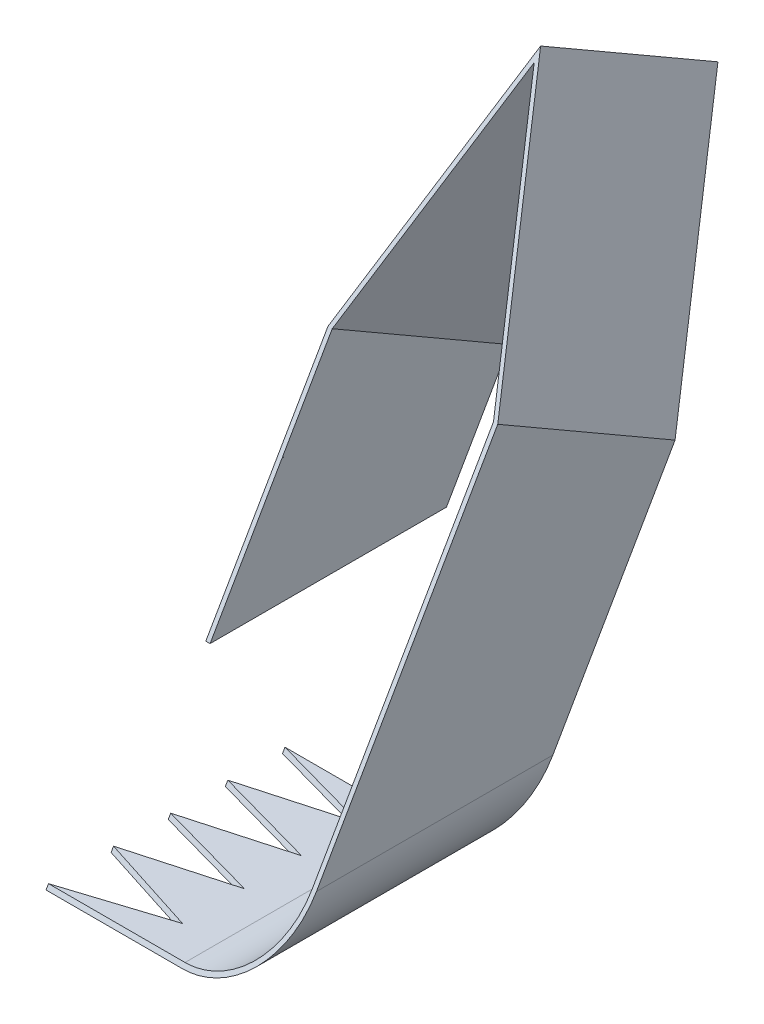
ISO-10303-21;
HEADER;
FILE_DESCRIPTION(('STEP AP214'),'2;1');
FILE_NAME('part.step','',(''),(''),'','','');
FILE_SCHEMA(('AUTOMOTIVE_DESIGN { 1 0 10303 214 1 1 1 1 }'));
ENDSEC;
DATA;
#1=APPLICATION_CONTEXT('core data for automotive mechanical design processes');
#2=APPLICATION_PROTOCOL_DEFINITION('international standard','automotive_design',2000,#1);
#3=PRODUCT_CONTEXT('',#1,'mechanical');
#4=PRODUCT('Part','Part','',(#3));
#5=PRODUCT_RELATED_PRODUCT_CATEGORY('part','',(#4));
#6=PRODUCT_DEFINITION_FORMATION('','',#4);
#7=PRODUCT_DEFINITION_CONTEXT('part definition',#1,'design');
#8=PRODUCT_DEFINITION('design','',#6,#7);
#9=PRODUCT_DEFINITION_SHAPE('','',#8);
#10=(LENGTH_UNIT() NAMED_UNIT(*) SI_UNIT(.MILLI.,.METRE.));
#11=(NAMED_UNIT(*) PLANE_ANGLE_UNIT() SI_UNIT($,.RADIAN.));
#12=(NAMED_UNIT(*) SI_UNIT($,.STERADIAN.) SOLID_ANGLE_UNIT());
#13=UNCERTAINTY_MEASURE_WITH_UNIT(LENGTH_MEASURE(1.E-05),#10,'distance_accuracy_value','');
#14=(GEOMETRIC_REPRESENTATION_CONTEXT(3) GLOBAL_UNCERTAINTY_ASSIGNED_CONTEXT((#13)) GLOBAL_UNIT_ASSIGNED_CONTEXT((#10,
#11,#12)) REPRESENTATION_CONTEXT('',''));
#15=CARTESIAN_POINT('',(0.,0.,0.));
#16=DIRECTION('',(0.,0.,1.));
#17=DIRECTION('',(1.,0.,0.));
#18=AXIS2_PLACEMENT_3D('',#15,#16,#17);
#19=CARTESIAN_POINT('',(-31.5905173417457,-187.563529342786,-148.740190106902));
#20=DIRECTION('',(-1.0041011564048E-12,0.866025403784441,-0.499999999999995));
#21=DIRECTION('',(0.,0.499999999999995,0.866025403784442));
#22=AXIS2_PLACEMENT_3D('',#19,#20,#21);
#23=PLANE('',#22);
#24=DIRECTION('',(-1.,-8.69598958078802E-13,5.02012735208159E-13));
#25=VECTOR('',#24,1.);
#26=CARTESIAN_POINT('',(-31.5905173417457,-76.2662554089391,44.0323430904352));
#27=LINE('',#26,#25);
#28=CARTESIAN_POINT('',(30.0030173417445,-76.2662554088856,44.0323430904042));
#29=VERTEX_POINT('',#28);
#30=CARTESIAN_POINT('',(29.8722197238395,-76.2662554088839,44.0323430904058));
#31=VERTEX_POINT('',#30);
#32=EDGE_CURVE('E46',#29,#31,#27,.T.);
#33=ORIENTED_EDGE('',*,*,#32,.F.);
#34=DIRECTION('',(0.,-0.499999999999995,-0.866025403784442));
#35=VECTOR('',#34,1.);
#36=CARTESIAN_POINT('',(30.0030173417445,-187.563529342732,-148.740190106932));
#37=LINE('',#36,#35);
#38=CARTESIAN_POINT('',(30.0030173417445,-76.5820287921031,43.4854075470633));
#39=VERTEX_POINT('',#38);
#40=EDGE_CURVE('E11',#29,#39,#37,.T.);
#41=ORIENTED_EDGE('',*,*,#40,.T.);
#42=DIRECTION('',(0.202803010333532,-0.489609778037303,-0.848029011443547));
#43=VECTOR('',#42,1.);
#44=CARTESIAN_POINT('',(-5597.68387285999,13509.8559863222,23575.8863436219));
#45=LINE('',#44,#43);
#46=EDGE_CURVE('E287',#31,#39,#45,.T.);
#47=ORIENTED_EDGE('',*,*,#46,.F.);
#48=EDGE_LOOP('',(#33,#41,#47));
#49=FACE_BOUND('',#48,.T.);
#50=ADVANCED_FACE('F33',(#49),#23,.T.);
#51=CARTESIAN_POINT('',(0.,-38.0999999999996,-65.9911357683745));
#52=DIRECTION('',(0.,-0.499999999999995,-0.866025403784442));
#53=DIRECTION('',(0.,0.866025403784442,-0.499999999999995));
#54=AXIS2_PLACEMENT_3D('',#51,#52,#53);
#55=PLANE('',#54);
#56=DIRECTION('',(0.,-0.866025403784442,0.499999999999995));
#57=VECTOR('',#56,1.);
#58=CARTESIAN_POINT('',(30.0030173416985,252509.141421164,-145874.208953373));
#59=LINE('',#58,#57);
#60=CARTESIAN_POINT('',(30.0030173417445,-82.3509859396307,-40.4428171242225));
#61=VERTEX_POINT('',#60);
#62=CARTESIAN_POINT('',(30.0030173417445,-161.108289208869,5.02773311893634));
#63=VERTEX_POINT('',#62);
#64=EDGE_CURVE('E286',#61,#63,#59,.T.);
#65=ORIENTED_EDGE('',*,*,#64,.F.);
#66=DIRECTION('',(-0.315271997454304,0.821859279752857,-0.474500676401297));
#67=VECTOR('',#66,1.);
#68=CARTESIAN_POINT('',(30.0030173417445,-82.3509859396307,-40.4428171242225));
#69=LINE('',#68,#67);
#70=CARTESIAN_POINT('',(0.,-4.13833647502804,-85.5989113466441));
#71=VERTEX_POINT('',#70);
#72=EDGE_CURVE('E263',#61,#71,#69,.T.);
#73=ORIENTED_EDGE('',*,*,#72,.T.);
#74=DIRECTION('',(-0.315271997446998,-0.821859279754959,0.474500676402511));
#75=VECTOR('',#74,1.);
#76=CARTESIAN_POINT('',(0.,-4.13833647502802,-85.5989113466441));
#77=LINE('',#76,#75);
#78=CARTESIAN_POINT('',(-30.0030173409861,-82.3509859396663,-40.4428171242019));
#79=VERTEX_POINT('',#78);
#80=EDGE_CURVE('E260',#71,#79,#77,.T.);
#81=ORIENTED_EDGE('',*,*,#80,.T.);
#82=DIRECTION('',(-2.13245697308716E-11,-0.866025403784442,0.499999999999995));
#83=VECTOR('',#82,1.);
#84=CARTESIAN_POINT('',(-30.0030173417745,-114.366255408937,-21.9587926779401));
#85=LINE('',#84,#83);
#86=CARTESIAN_POINT('',(-30.0030173417554,-123.008289208855,-16.9693121372121));
#87=VERTEX_POINT('',#86);
#88=EDGE_CURVE('E257',#79,#87,#85,.T.);
#89=ORIENTED_EDGE('',*,*,#88,.T.);
#90=DIRECTION('',(1.,0.,0.));
#91=VECTOR('',#90,1.);
#92=CARTESIAN_POINT('',(-400008.939522454,-123.008289208855,-16.9693121372121));
#93=LINE('',#92,#91);
#94=CARTESIAN_POINT('',(-31.5905173417457,-123.008289208883,-16.9693121371779));
#95=VERTEX_POINT('',#94);
#96=EDGE_CURVE('E223',#95,#87,#93,.T.);
#97=ORIENTED_EDGE('',*,*,#96,.F.);
#98=DIRECTION('',(0.,0.866025403784442,-0.499999999999995));
#99=VECTOR('',#98,1.);
#100=CARTESIAN_POINT('',(-31.590517340984,-82.3509859396664,-40.4428171242018));
#101=LINE('',#100,#99);
#102=CARTESIAN_POINT('',(-31.590517340984,-82.3509859396664,-40.4428171242019));
#103=VERTEX_POINT('',#102);
#104=EDGE_CURVE('E272',#95,#103,#101,.T.);
#105=ORIENTED_EDGE('',*,*,#104,.T.);
#106=DIRECTION('',(0.315271997446998,0.821859279754959,-0.474500676402511));
#107=VECTOR('',#106,1.);
#108=CARTESIAN_POINT('',(-31.590517340984,-82.3509859396664,-40.4428171242019));
#109=LINE('',#108,#107);
#110=CARTESIAN_POINT('',(0.,6.14791264033165E-11,-87.9881810245342));
#111=VERTEX_POINT('',#110);
#112=EDGE_CURVE('E269',#103,#111,#109,.T.);
#113=ORIENTED_EDGE('',*,*,#112,.T.);
#114=DIRECTION('',(0.315271997454304,-0.821859279752857,0.474500676401297));
#115=VECTOR('',#114,1.);
#116=CARTESIAN_POINT('',(0.,6.1478599988618E-11,-87.9881810245342));
#117=LINE('',#116,#115);
#118=CARTESIAN_POINT('',(31.5905173417832,-82.3509859396307,-40.4428171242225));
#119=VERTEX_POINT('',#118);
#120=EDGE_CURVE('E266',#111,#119,#117,.T.);
#121=ORIENTED_EDGE('',*,*,#120,.T.);
#122=DIRECTION('',(0.,0.866025403784442,-0.499999999999995));
#123=VECTOR('',#122,1.);
#124=CARTESIAN_POINT('',(31.5905173416695,252509.141421164,-145874.208953373));
#125=LINE('',#124,#123);
#126=CARTESIAN_POINT('',(31.5905173417264,-161.108289208869,5.02773311892057));
#127=VERTEX_POINT('',#126);
#128=EDGE_CURVE('E290',#127,#119,#125,.T.);
#129=ORIENTED_EDGE('',*,*,#128,.F.);
#130=CARTESIAN_POINT('',(0.,-161.108289208823,5.02773311889382));
#131=DIRECTION('',(0.,-0.499999999999995,-0.866025403784442));
#132=DIRECTION('',(0.,-0.866025403784442,0.499999999999995));
#133=AXIS2_PLACEMENT_3D('',#130,#131,#132);
#134=ELLIPSE('',#133,36.4775873821841,31.5905173417382);
#135=CARTESIAN_POINT('',(0.,-192.698806550604,23.2665268100107));
#136=VERTEX_POINT('',#135);
#137=EDGE_CURVE('E259',#127,#136,#134,.T.);
#138=ORIENTED_EDGE('',*,*,#137,.T.);
#139=DIRECTION('',(1.,0.,0.));
#140=VECTOR('',#139,1.);
#141=CARTESIAN_POINT('',(-400008.939522454,-192.698806550823,23.2665268101369));
#142=LINE('',#141,#140);
#143=CARTESIAN_POINT('',(-50.7999999996969,-192.698806550604,23.2665268110708));
#144=VERTEX_POINT('',#143);
#145=EDGE_CURVE('E298',#144,#136,#142,.T.);
#146=ORIENTED_EDGE('',*,*,#145,.F.);
#147=DIRECTION('',(0.,-0.866025403784442,0.499999999999995));
#148=VECTOR('',#147,1.);
#149=CARTESIAN_POINT('',(-50.7999999999811,252509.141421164,-145874.208953373));
#150=LINE('',#149,#148);
#151=CARTESIAN_POINT('',(-50.7999999996969,-191.111306550567,22.3499832582673));
#152=VERTEX_POINT('',#151);
#153=EDGE_CURVE('E309',#152,#144,#150,.T.);
#154=ORIENTED_EDGE('',*,*,#153,.F.);
#155=DIRECTION('',(-1.,0.,0.));
#156=VECTOR('',#155,1.);
#157=CARTESIAN_POINT('',(-400008.939522454,-191.111306550567,22.349983257651));
#158=LINE('',#157,#156);
#159=CARTESIAN_POINT('',(0.,-191.111306550567,22.349983257651));
#160=VERTEX_POINT('',#159);
#161=EDGE_CURVE('E293',#160,#152,#158,.T.);
#162=ORIENTED_EDGE('',*,*,#161,.F.);
#163=CARTESIAN_POINT('',(0.,-161.108289208823,5.02773311889382));
#164=DIRECTION('',(0.,-0.499999999999995,-0.866025403784442));
#165=DIRECTION('',(0.,-0.866025403784442,0.499999999999995));
#166=AXIS2_PLACEMENT_3D('',#163,#164,#165);
#167=ELLIPSE('',#166,34.644500277507,30.0030173417382);
#168=EDGE_CURVE('E294',#63,#160,#167,.T.);
#169=ORIENTED_EDGE('',*,*,#168,.F.);
#170=EDGE_LOOP('',(#65,#73,#81,#89,#97,#105,#113,#121,#129,#138,#146,#154,#162,#169));
#171=FACE_BOUND('',#170,.T.);
#172=ADVANCED_FACE('F453',(#171),#55,.T.);
#173=CARTESIAN_POINT('',(21.2153370184007,-182.323626227223,105.264594681915));
#174=DIRECTION('',(0.,0.499999999999995,0.866025403784441));
#175=DIRECTION('',(0.,-0.866025403784442,0.499999999999995));
#176=AXIS2_PLACEMENT_3D('',#173,#174,#175);
#177=PLANE('',#176);
#178=DIRECTION('',(0.,0.866025403784442,-0.499999999999995));
#179=VECTOR('',#178,1.);
#180=CARTESIAN_POINT('',(31.5905173416695,252398.451901602,-145722.314148433));
#181=LINE('',#180,#179);
#182=CARTESIAN_POINT('',(31.5905173417264,-161.108289208869,93.0159141434217));
#183=VERTEX_POINT('',#182);
#184=CARTESIAN_POINT('',(31.5905173417832,-44.2509859396311,25.548318644152));
#185=VERTEX_POINT('',#184);
#186=EDGE_CURVE('E315',#183,#185,#181,.T.);
#187=ORIENTED_EDGE('',*,*,#186,.T.);
#188=DIRECTION('',(0.315271997454304,-0.821859279752857,0.474500676401297));
#189=VECTOR('',#188,1.);
#190=CARTESIAN_POINT('',(0.,38.1000000000611,-21.9970452561597));
#191=LINE('',#190,#189);
#192=CARTESIAN_POINT('',(0.,38.1000000000611,-21.9970452561597));
#193=VERTEX_POINT('',#192);
#194=EDGE_CURVE('E247',#193,#185,#191,.T.);
#195=ORIENTED_EDGE('',*,*,#194,.F.);
#196=DIRECTION('',(0.315271997446998,0.821859279754959,-0.474500676402511));
#197=VECTOR('',#196,1.);
#198=CARTESIAN_POINT('',(-31.590517340984,-44.2509859396668,25.5483186441726));
#199=LINE('',#198,#197);
#200=CARTESIAN_POINT('',(-31.590517340984,-44.2509859396668,25.5483186441726));
#201=VERTEX_POINT('',#200);
#202=EDGE_CURVE('E251',#201,#193,#199,.T.);
#203=ORIENTED_EDGE('',*,*,#202,.F.);
#204=DIRECTION('',(0.,0.866025403784442,-0.499999999999995));
#205=VECTOR('',#204,1.);
#206=CARTESIAN_POINT('',(-31.590517340984,-44.2509859396668,25.5483186441726));
#207=LINE('',#206,#205);
#208=CARTESIAN_POINT('',(-31.5905173417264,-123.008289208855,71.018868887279));
#209=VERTEX_POINT('',#208);
#210=EDGE_CURVE('E231',#209,#201,#207,.T.);
#211=ORIENTED_EDGE('',*,*,#210,.F.);
#212=DIRECTION('',(1.,0.,0.));
#213=VECTOR('',#212,1.);
#214=CARTESIAN_POINT('',(-400008.939522454,-123.008289208855,71.018868887279));
#215=LINE('',#214,#213);
#216=CARTESIAN_POINT('',(-30.0030173417554,-123.008289208855,71.018868887279));
#217=VERTEX_POINT('',#216);
#218=EDGE_CURVE('E217',#209,#217,#215,.T.);
#219=ORIENTED_EDGE('',*,*,#218,.T.);
#220=DIRECTION('',(0.,0.866025403784442,-0.499999999999995));
#221=VECTOR('',#220,1.);
#222=CARTESIAN_POINT('',(-30.0030173418122,252398.451901602,-145722.314148433));
#223=LINE('',#222,#221);
#224=CARTESIAN_POINT('',(-30.0030173417838,-76.5820287922452,44.2146549383153));
#225=VERTEX_POINT('',#224);
#226=EDGE_CURVE('E212',#217,#225,#223,.T.);
#227=ORIENTED_EDGE('',*,*,#226,.T.);
#228=DIRECTION('',(0.337652210855072,0.815164546811572,-0.470635470535494));
#229=VECTOR('',#228,1.);
#230=CARTESIAN_POINT('',(47024.4741132339,113522.974830218,-65542.5200774325));
#231=LINE('',#230,#229);
#232=CARTESIAN_POINT('',(-29.8722197237794,-76.2662554089453,44.032343090435));
#233=VERTEX_POINT('',#232);
#234=EDGE_CURVE('E209',#225,#233,#231,.T.);
#235=ORIENTED_EDGE('',*,*,#234,.T.);
#236=DIRECTION('',(-1.,-8.69598958078802E-13,5.02012735208159E-13));
#237=VECTOR('',#236,1.);
#238=CARTESIAN_POINT('',(-31.5905173417457,-76.2662554089391,44.0323430904352));
#239=LINE('',#238,#237);
#240=CARTESIAN_POINT('',(-30.0030173417745,-76.2662554089378,44.0323430904344));
#241=VERTEX_POINT('',#240);
#242=EDGE_CURVE('E195',#233,#241,#239,.T.);
#243=ORIENTED_EDGE('',*,*,#242,.T.);
#244=DIRECTION('',(-2.13245697308717E-11,-0.866025403784442,0.499999999999995));
#245=VECTOR('',#244,1.);
#246=CARTESIAN_POINT('',(-30.0030173417745,-76.2662554089378,44.0323430904344));
#247=LINE('',#246,#245);
#248=CARTESIAN_POINT('',(-30.0030173409861,-44.2509859396667,25.5483186441726));
#249=VERTEX_POINT('',#248);
#250=EDGE_CURVE('E232',#249,#241,#247,.T.);
#251=ORIENTED_EDGE('',*,*,#250,.F.);
#252=DIRECTION('',(-0.315271997446998,-0.821859279754959,0.474500676402511));
#253=VECTOR('',#252,1.);
#254=CARTESIAN_POINT('',(0.,33.9616635249716,-19.6077755782696));
#255=LINE('',#254,#253);
#256=CARTESIAN_POINT('',(0.,33.9616635249716,-19.6077755782696));
#257=VERTEX_POINT('',#256);
#258=EDGE_CURVE('E235',#257,#249,#255,.T.);
#259=ORIENTED_EDGE('',*,*,#258,.F.);
#260=DIRECTION('',(-0.315271997454304,0.821859279752857,-0.474500676401297));
#261=VECTOR('',#260,1.);
#262=CARTESIAN_POINT('',(30.0030173417445,-44.2509859396311,25.548318644152));
#263=LINE('',#262,#261);
#264=CARTESIAN_POINT('',(30.0030173417445,-44.2509859396311,25.548318644152));
#265=VERTEX_POINT('',#264);
#266=EDGE_CURVE('E239',#265,#257,#263,.T.);
#267=ORIENTED_EDGE('',*,*,#266,.F.);
#268=DIRECTION('',(0.,0.866025403784442,-0.499999999999995));
#269=VECTOR('',#268,1.);
#270=CARTESIAN_POINT('',(30.0030173417445,-76.2662554088856,44.0323430904042));
#271=LINE('',#270,#269);
#272=EDGE_CURVE('E243',#29,#265,#271,.T.);
#273=ORIENTED_EDGE('',*,*,#272,.F.);
#274=ORIENTED_EDGE('',*,*,#32,.T.);
#275=DIRECTION('',(0.337652210855072,-0.815164546811572,0.470635470535494));
#276=VECTOR('',#275,1.);
#277=CARTESIAN_POINT('',(-138233.724881796,333721.585049569,-192674.246962755));
#278=LINE('',#277,#276);
#279=CARTESIAN_POINT('',(30.0030173417554,-76.5820287921031,44.2146549382016));
#280=VERTEX_POINT('',#279);
#281=EDGE_CURVE('E317',#31,#280,#278,.T.);
#282=ORIENTED_EDGE('',*,*,#281,.T.);
#283=DIRECTION('',(0.,-0.866025403784442,0.499999999999995));
#284=VECTOR('',#283,1.);
#285=CARTESIAN_POINT('',(30.0030173416985,252398.451901602,-145722.314148433));
#286=LINE('',#285,#284);
#287=CARTESIAN_POINT('',(30.0030173417382,-161.108289208823,93.0159141433933));
#288=VERTEX_POINT('',#287);
#289=EDGE_CURVE('E319',#280,#288,#286,.T.);
#290=ORIENTED_EDGE('',*,*,#289,.T.);
#291=CARTESIAN_POINT('',(30.0030173417382,-161.108289208823,93.0159141433933));
#292=CARTESIAN_POINT('',(30.0030173417382,-178.683649855498,103.163053343856));
#293=CARTESIAN_POINT('',(17.5753606466751,-191.111306550561,110.338164282147));
#294=CARTESIAN_POINT('',(0.,-191.111306550561,110.338164282147));
#295=(BOUNDED_CURVE() B_SPLINE_CURVE(3,(#291,#292,#293,#294),.UNSPECIFIED.,.F.,
.F.) B_SPLINE_CURVE_WITH_KNOTS((4,4),(0.,1.),
.UNSPECIFIED.) CURVE() GEOMETRIC_REPRESENTATION_ITEM() RATIONAL_B_SPLINE_CURVE((1.,
0.804737854124365,0.804737854124365,1.)) REPRESENTATION_ITEM(''));
#296=CARTESIAN_POINT('',(0.,-191.111306550567,110.338164282155));
#297=VERTEX_POINT('',#296);
#298=EDGE_CURVE('E322',#288,#297,#295,.T.);
#299=ORIENTED_EDGE('',*,*,#298,.T.);
#300=DIRECTION('',(-1.,0.,0.));
#301=VECTOR('',#300,1.);
#302=CARTESIAN_POINT('',(-400008.939522454,-191.111306550567,110.338164282155));
#303=LINE('',#302,#301);
#304=CARTESIAN_POINT('',(-50.7999999999811,-191.111306550567,110.338164282733));
#305=VERTEX_POINT('',#304);
#306=EDGE_CURVE('E327',#297,#305,#303,.T.);
#307=ORIENTED_EDGE('',*,*,#306,.T.);
#308=DIRECTION('',(0.,-0.866025403784442,0.499999999999995));
#309=VECTOR('',#308,1.);
#310=CARTESIAN_POINT('',(-50.7999999999811,252398.451901602,-145722.314148433));
#311=LINE('',#310,#309);
#312=CARTESIAN_POINT('',(-50.7999999999811,-192.698806550604,111.254707835093));
#313=VERTEX_POINT('',#312);
#314=EDGE_CURVE('E333',#305,#313,#311,.T.);
#315=ORIENTED_EDGE('',*,*,#314,.T.);
#316=DIRECTION('',(1.,0.,0.));
#317=VECTOR('',#316,1.);
#318=CARTESIAN_POINT('',(-400008.939522454,-192.698806550823,111.254707834632));
#319=LINE('',#318,#317);
#320=CARTESIAN_POINT('',(0.,-192.698806550561,111.254707834485));
#321=VERTEX_POINT('',#320);
#322=EDGE_CURVE('E336',#313,#321,#319,.T.);
#323=ORIENTED_EDGE('',*,*,#322,.T.);
#324=CARTESIAN_POINT('',(31.5905173417382,-161.108289208823,93.0159141433933));
#325=CARTESIAN_POINT('',(31.5905173417382,-179.61358582523,103.69995212631));
#326=CARTESIAN_POINT('',(18.5052966164078,-192.698806550561,111.254707834485));
#327=CARTESIAN_POINT('',(0.,-192.698806550561,111.254707834485));
#328=(BOUNDED_CURVE() B_SPLINE_CURVE(3,(#324,#325,#326,#327),.UNSPECIFIED.,.F.,
.F.) B_SPLINE_CURVE_WITH_KNOTS((4,4),(0.,1.),
.UNSPECIFIED.) CURVE() GEOMETRIC_REPRESENTATION_ITEM() RATIONAL_B_SPLINE_CURVE((1.,
0.804737854124365,0.804737854124365,1.)) REPRESENTATION_ITEM(''));
#329=EDGE_CURVE('E301',#183,#321,#328,.T.);
#330=ORIENTED_EDGE('',*,*,#329,.F.);
#331=EDGE_LOOP('',(#187,#195,#203,#211,#219,#227,#235,#243,#251,#259,#267,#273,#274,#282,#290,
#299,#307,#315,#323,#330));
#332=FACE_BOUND('',#331,.T.);
#333=ADVANCED_FACE('F214',(#332),#177,.T.);
#334=CARTESIAN_POINT('',(-138233.724881796,333721.585049569,-193017.861639443));
#335=DIRECTION('',(-0.923879532511287,-0.382683432365091,0.));
#336=DIRECTION('',(0.382683432365091,-0.923879532511287,0.));
#337=AXIS2_PLACEMENT_3D('',#334,#335,#336);
#338=PLANE('',#337);
#339=ORIENTED_EDGE('',*,*,#281,.F.);
#340=ORIENTED_EDGE('',*,*,#46,.T.);
#341=DIRECTION('',(0.,0.,1.));
#342=VECTOR('',#341,1.);
#343=CARTESIAN_POINT('',(30.0030173417554,-76.5820287921031,-299.400021749922));
#344=LINE('',#343,#342);
#345=EDGE_CURVE('E283',#39,#280,#344,.T.);
#346=ORIENTED_EDGE('',*,*,#345,.T.);
#347=EDGE_LOOP('',(#339,#340,#346));
#348=FACE_BOUND('',#347,.T.);
#349=ADVANCED_FACE('F407',(#348),#338,.T.);
#350=CARTESIAN_POINT('',(30.0030173416985,252398.451901602,-146065.928825121));
#351=DIRECTION('',(-1.,0.,0.));
#352=DIRECTION('',(0.,-1.,0.));
#353=AXIS2_PLACEMENT_3D('',#350,#351,#352);
#354=PLANE('',#353);
#355=ORIENTED_EDGE('',*,*,#345,.F.);
#356=ORIENTED_EDGE('',*,*,#40,.F.);
#357=ORIENTED_EDGE('',*,*,#272,.T.);
#358=DIRECTION('',(0.,0.499999999999995,0.866025403784442));
#359=VECTOR('',#358,1.);
#360=CARTESIAN_POINT('',(30.0030173417445,-155.548259873307,-167.224214552888));
#361=LINE('',#360,#359);
#362=EDGE_CURVE('E242',#61,#265,#361,.T.);
#363=ORIENTED_EDGE('',*,*,#362,.F.);
#364=ORIENTED_EDGE('',*,*,#64,.T.);
#365=DIRECTION('',(0.,0.,1.));
#366=VECTOR('',#365,1.);
#367=CARTESIAN_POINT('',(30.0030173417382,-161.108289208823,-250.598762544731));
#368=LINE('',#367,#366);
#369=EDGE_CURVE('E288',#63,#288,#368,.T.);
#370=ORIENTED_EDGE('',*,*,#369,.T.);
#371=ORIENTED_EDGE('',*,*,#289,.F.);
#372=EDGE_LOOP('',(#355,#356,#357,#363,#364,#370,#371));
#373=FACE_BOUND('',#372,.T.);
#374=ADVANCED_FACE('F410',(#373),#354,.T.);
#375=CARTESIAN_POINT('',(31.5905173416695,252398.451901602,-146065.928825121));
#376=DIRECTION('',(1.,0.,0.));
#377=DIRECTION('',(0.,1.,0.));
#378=AXIS2_PLACEMENT_3D('',#375,#376,#377);
#379=PLANE('',#378);
#380=ORIENTED_EDGE('',*,*,#128,.T.);
#381=DIRECTION('',(0.,0.499999999999995,0.866025403784442));
#382=VECTOR('',#381,1.);
#383=CARTESIAN_POINT('',(31.5905173417832,-155.548259873307,-167.224214552888));
#384=LINE('',#383,#382);
#385=EDGE_CURVE('E246',#119,#185,#384,.T.);
#386=ORIENTED_EDGE('',*,*,#385,.T.);
#387=ORIENTED_EDGE('',*,*,#186,.F.);
#388=DIRECTION('',(0.,0.,1.));
#389=VECTOR('',#388,1.);
#390=CARTESIAN_POINT('',(31.5905173417264,-161.108289208869,-250.598762544702));
#391=LINE('',#390,#389);
#392=EDGE_CURVE('E299',#127,#183,#391,.T.);
#393=ORIENTED_EDGE('',*,*,#392,.F.);
#394=EDGE_LOOP('',(#380,#386,#387,#393));
#395=FACE_BOUND('',#394,.T.);
#396=ADVANCED_FACE('F439',(#395),#379,.T.);
#397=CARTESIAN_POINT('',(0.,-161.108289208823,-250.598762544731));
#398=DIRECTION('',(0.,0.,1.));
#399=DIRECTION('',(1.,0.,0.));
#400=AXIS2_PLACEMENT_3D('',#397,#398,#399);
#401=CYLINDRICAL_SURFACE('',#400,30.0030173417382);
#402=ORIENTED_EDGE('',*,*,#369,.F.);
#403=ORIENTED_EDGE('',*,*,#168,.T.);
#404=DIRECTION('',(0.,0.,1.));
#405=VECTOR('',#404,1.);
#406=CARTESIAN_POINT('',(0.,-191.111306550567,-233.276512405969));
#407=LINE('',#406,#405);
#408=EDGE_CURVE('E291',#160,#297,#407,.T.);
#409=ORIENTED_EDGE('',*,*,#408,.T.);
#410=ORIENTED_EDGE('',*,*,#298,.F.);
#411=EDGE_LOOP('',(#402,#403,#409,#410));
#412=FACE_BOUND('',#411,.T.);
#413=ADVANCED_FACE('F415',(#412),#401,.F.);
#414=CARTESIAN_POINT('',(-400008.939522454,-191.111306550567,-233.276512405969));
#415=DIRECTION('',(0.,1.,0.));
#416=DIRECTION('',(0.,0.,1.));
#417=AXIS2_PLACEMENT_3D('',#414,#415,#416);
#418=PLANE('',#417);
#419=DIRECTION('',(-0.963200574895353,0.,-0.268783653746393));
#420=VECTOR('',#419,1.);
#421=CARTESIAN_POINT('',(-371180.282509979,-191.111306550567,-103542.30822189));
#422=LINE('',#421,#420);
#423=CARTESIAN_POINT('',(-12.6999999998816,-191.111306550567,32.9818884657698));
#424=VERTEX_POINT('',#423);
#425=EDGE_CURVE('E311',#424,#152,#422,.T.);
#426=ORIENTED_EDGE('',*,*,#425,.F.);
#427=DIRECTION('',(0.963200574895353,0.,-0.268783653746392));
#428=VECTOR('',#427,1.);
#429=CARTESIAN_POINT('',(-371042.417866708,-191.111306550567,103569.800507518));
#430=LINE('',#429,#428);
#431=CARTESIAN_POINT('',(-50.7999999996969,-191.111306550567,43.6137936727334));
#432=VERTEX_POINT('',#431);
#433=EDGE_CURVE('E364',#432,#424,#430,.T.);
#434=ORIENTED_EDGE('',*,*,#433,.F.);
#435=DIRECTION('',(-0.963200574895353,0.,-0.268783653746393));
#436=VECTOR('',#435,1.);
#437=CARTESIAN_POINT('',(-371185.787552501,-191.111306550567,-103522.580608071));
#438=LINE('',#437,#436);
#439=CARTESIAN_POINT('',(-12.6999999995405,-191.111306550567,54.2456988793276));
#440=VERTEX_POINT('',#439);
#441=EDGE_CURVE('E361',#440,#432,#438,.T.);
#442=ORIENTED_EDGE('',*,*,#441,.F.);
#443=DIRECTION('',(0.963200574895353,0.,-0.268783653746392));
#444=VECTOR('',#443,1.);
#445=CARTESIAN_POINT('',(-371036.912824186,-191.111306550567,103589.528121338));
#446=LINE('',#445,#444);
#447=CARTESIAN_POINT('',(-50.7999999994695,-191.111306550567,64.8776040872718));
#448=VERTEX_POINT('',#447);
#449=EDGE_CURVE('E358',#448,#440,#446,.T.);
#450=ORIENTED_EDGE('',*,*,#449,.F.);
#451=DIRECTION('',(-0.963200574895353,0.,-0.268783653746393));
#452=VECTOR('',#451,1.);
#453=CARTESIAN_POINT('',(-371191.292595023,-191.111306550567,-103502.852994251));
#454=LINE('',#453,#452);
#455=CARTESIAN_POINT('',(-12.6999999999384,-191.111306550567,75.509509293866));
#456=VERTEX_POINT('',#455);
#457=EDGE_CURVE('E355',#456,#448,#454,.T.);
#458=ORIENTED_EDGE('',*,*,#457,.F.);
#459=DIRECTION('',(0.963200574895354,0.,-0.268783653746392));
#460=VECTOR('',#459,1.);
#461=CARTESIAN_POINT('',(-371031.407781664,-191.111306550567,103609.255735156));
#462=LINE('',#461,#460);
#463=CARTESIAN_POINT('',(-50.8000000002085,-191.111306550567,86.1414145008013));
#464=VERTEX_POINT('',#463);
#465=EDGE_CURVE('E352',#464,#456,#462,.T.);
#466=ORIENTED_EDGE('',*,*,#465,.F.);
#467=DIRECTION('',(-0.952337616963072,0.,-0.305046001968716));
#468=VECTOR('',#467,1.);
#469=CARTESIAN_POINT('',(-362884.402515526,-191.111306550567,-116134.133681026));
#470=LINE('',#469,#468);
#471=CARTESIAN_POINT('',(-13.029508210991,-191.111306550567,98.2397893922382));
#472=VERTEX_POINT('',#471);
#473=EDGE_CURVE('E349',#472,#464,#470,.T.);
#474=ORIENTED_EDGE('',*,*,#473,.F.);
#475=DIRECTION('',(0.952337616963072,0.,-0.305046001968716));
#476=VECTOR('',#475,1.);
#477=CARTESIAN_POINT('',(-362691.787047111,-191.111306550567,116268.916044966));
#478=LINE('',#477,#476);
#479=EDGE_CURVE('E40',#305,#472,#478,.T.);
#480=ORIENTED_EDGE('',*,*,#479,.F.);
#481=ORIENTED_EDGE('',*,*,#306,.F.);
#482=ORIENTED_EDGE('',*,*,#408,.F.);
#483=ORIENTED_EDGE('',*,*,#161,.T.);
#484=EDGE_LOOP('',(#426,#434,#442,#450,#458,#466,#474,#480,#481,#482,#483));
#485=FACE_BOUND('',#484,.T.);
#486=ADVANCED_FACE('F421',(#485),#418,.T.);
#487=CARTESIAN_POINT('',(-400008.939522454,-192.698806550823,-232.359968853492));
#488=DIRECTION('',(0.,-1.,0.));
#489=DIRECTION('',(1.,0.,0.));
#490=AXIS2_PLACEMENT_3D('',#487,#488,#489);
#491=PLANE('',#490);
#492=DIRECTION('',(-0.963200574895353,0.,-0.268783653746392));
#493=VECTOR('',#492,1.);
#494=CARTESIAN_POINT('',(-371164.507558919,-192.698806550807,-103536.989636755));
#495=LINE('',#494,#493);
#496=CARTESIAN_POINT('',(-12.6999999998816,-192.698806550604,33.8984320180202));
#497=VERTEX_POINT('',#496);
#498=EDGE_CURVE('E308',#497,#144,#495,.T.);
#499=ORIENTED_EDGE('',*,*,#498,.T.);
#500=ORIENTED_EDGE('',*,*,#145,.T.);
#501=DIRECTION('',(0.,0.,1.));
#502=VECTOR('',#501,1.);
#503=CARTESIAN_POINT('',(0.,-192.698806550561,-232.359968853639));
#504=LINE('',#503,#502);
#505=EDGE_CURVE('E295',#136,#321,#504,.T.);
#506=ORIENTED_EDGE('',*,*,#505,.T.);
#507=ORIENTED_EDGE('',*,*,#322,.F.);
#508=DIRECTION('',(0.952337616963071,0.,-0.305046001968716));
#509=VECTOR('',#508,1.);
#510=CARTESIAN_POINT('',(-362709.488328692,-192.698806550802,116275.502536949));
#511=LINE('',#510,#509);
#512=CARTESIAN_POINT('',(-13.0295082110479,-192.698806550604,99.1563329440197));
#513=VERTEX_POINT('',#512);
#514=EDGE_CURVE('E297',#313,#513,#511,.T.);
#515=ORIENTED_EDGE('',*,*,#514,.T.);
#516=DIRECTION('',(-0.952337616963072,0.,-0.305046001968715));
#517=VECTOR('',#516,1.);
#518=CARTESIAN_POINT('',(-362866.701233945,-192.698806550802,-116127.547189044));
#519=LINE('',#518,#517);
#520=CARTESIAN_POINT('',(-50.8000000002653,-192.69880655072,87.0579580534859));
#521=VERTEX_POINT('',#520);
#522=EDGE_CURVE('E371',#513,#521,#519,.T.);
#523=ORIENTED_EDGE('',*,*,#522,.T.);
#524=DIRECTION('',(0.963200574895353,0.,-0.268783653746392));
#525=VECTOR('',#524,1.);
#526=CARTESIAN_POINT('',(-371047.182732723,-192.698806550807,103614.574320292));
#527=LINE('',#526,#525);
#528=CARTESIAN_POINT('',(-12.6999999999384,-192.698806550604,76.4260528459602));
#529=VERTEX_POINT('',#528);
#530=EDGE_CURVE('E367',#521,#529,#527,.T.);
#531=ORIENTED_EDGE('',*,*,#530,.T.);
#532=DIRECTION('',(-0.963200574895353,0.,-0.268783653746392));
#533=VECTOR('',#532,1.);
#534=CARTESIAN_POINT('',(-371175.517643963,-192.698806550807,-103497.534409116));
#535=LINE('',#534,#533);
#536=CARTESIAN_POINT('',(-50.7999999994695,-192.698806550604,65.7941476392381));
#537=VERTEX_POINT('',#536);
#538=EDGE_CURVE('E370',#529,#537,#535,.T.);
#539=ORIENTED_EDGE('',*,*,#538,.T.);
#540=DIRECTION('',(0.963200574895353,0.,-0.268783653746393));
#541=VECTOR('',#540,1.);
#542=CARTESIAN_POINT('',(-371052.687775245,-192.698806550807,103594.846706473));
#543=LINE('',#542,#541);
#544=CARTESIAN_POINT('',(-12.6999999995405,-192.698806550604,55.162242432516));
#545=VERTEX_POINT('',#544);
#546=EDGE_CURVE('E374',#537,#545,#543,.T.);
#547=ORIENTED_EDGE('',*,*,#546,.T.);
#548=DIRECTION('',(-0.963200574895353,0.,-0.268783653746392));
#549=VECTOR('',#548,1.);
#550=CARTESIAN_POINT('',(-371170.012601441,-192.698806550807,-103517.262022936));
#551=LINE('',#550,#549);
#552=CARTESIAN_POINT('',(-50.7999999996969,-192.698806550604,44.5303372245007));
#553=VERTEX_POINT('',#552);
#554=EDGE_CURVE('E377',#545,#553,#551,.T.);
#555=ORIENTED_EDGE('',*,*,#554,.T.);
#556=DIRECTION('',(0.963200574895353,0.,-0.268783653746393));
#557=VECTOR('',#556,1.);
#558=CARTESIAN_POINT('',(-371058.192817767,-192.698806550807,103575.119092653));
#559=LINE('',#558,#557);
#560=EDGE_CURVE('E302',#553,#497,#559,.T.);
#561=ORIENTED_EDGE('',*,*,#560,.T.);
#562=EDGE_LOOP('',(#499,#500,#506,#507,#515,#523,#531,#539,#547,#555,#561));
#563=FACE_BOUND('',#562,.T.);
#564=ADVANCED_FACE('F430',(#563),#491,.T.);
#565=CARTESIAN_POINT('',(0.,-161.108289208823,-250.598762544702));
#566=DIRECTION('',(0.,0.,1.));
#567=DIRECTION('',(1.,0.,0.));
#568=AXIS2_PLACEMENT_3D('',#565,#566,#567);
#569=CYLINDRICAL_SURFACE('',#568,31.5905173417382);
#570=ORIENTED_EDGE('',*,*,#137,.F.);
#571=ORIENTED_EDGE('',*,*,#392,.T.);
#572=ORIENTED_EDGE('',*,*,#329,.T.);
#573=ORIENTED_EDGE('',*,*,#505,.F.);
#574=EDGE_LOOP('',(#570,#571,#572,#573));
#575=FACE_BOUND('',#574,.T.);
#576=ADVANCED_FACE('F435',(#575),#569,.T.);
#577=CARTESIAN_POINT('',(-362884.402515526,-298.23685556395,-116072.284716466));
#578=DIRECTION('',(0.267305077508172,-0.481805976389441,-0.834512430496854));
#579=DIRECTION('',(0.,0.866025403784441,-0.499999999999995));
#580=AXIS2_PLACEMENT_3D('',#577,#578,#579);
#581=PLANE('',#580);
#582=DIRECTION('',(0.,0.866025403784442,-0.499999999999995));
#583=VECTOR('',#582,1.);
#584=CARTESIAN_POINT('',(-13.029508210991,-298.23685556395,160.0887539522));
#585=LINE('',#584,#583);
#586=EDGE_CURVE('E343',#513,#472,#585,.T.);
#587=ORIENTED_EDGE('',*,*,#586,.T.);
#588=ORIENTED_EDGE('',*,*,#473,.T.);
#589=DIRECTION('',(0.,0.866025403784442,-0.499999999999995));
#590=VECTOR('',#589,1.);
#591=CARTESIAN_POINT('',(-50.8000000002085,-298.23685556395,147.990379060763));
#592=LINE('',#591,#590);
#593=EDGE_CURVE('E350',#521,#464,#592,.T.);
#594=ORIENTED_EDGE('',*,*,#593,.F.);
#595=ORIENTED_EDGE('',*,*,#522,.F.);
#596=EDGE_LOOP('',(#587,#588,#594,#595));
#597=FACE_BOUND('',#596,.T.);
#598=ADVANCED_FACE('F495',(#597),#581,.F.);
#599=CARTESIAN_POINT('',(-371031.407781664,-298.23685556395,103671.104699716));
#600=DIRECTION('',(0.234904462052635,0.486009231833034,0.841792682482348));
#601=DIRECTION('',(0.,-0.866025403784442,0.499999999999995));
#602=AXIS2_PLACEMENT_3D('',#599,#600,#601);
#603=PLANE('',#602);
#604=ORIENTED_EDGE('',*,*,#593,.T.);
#605=ORIENTED_EDGE('',*,*,#465,.T.);
#606=DIRECTION('',(0.,0.866025403784442,-0.499999999999995));
#607=VECTOR('',#606,1.);
#608=CARTESIAN_POINT('',(-12.6999999999384,-298.23685556395,137.358473853828));
#609=LINE('',#608,#607);
#610=EDGE_CURVE('E353',#529,#456,#609,.T.);
#611=ORIENTED_EDGE('',*,*,#610,.F.);
#612=ORIENTED_EDGE('',*,*,#530,.F.);
#613=EDGE_LOOP('',(#604,#605,#611,#612));
#614=FACE_BOUND('',#613,.T.);
#615=ADVANCED_FACE('F492',(#614),#603,.F.);
#616=CARTESIAN_POINT('',(-371191.292595023,-298.23685556395,-103441.004029691));
#617=DIRECTION('',(0.234904462052636,-0.486009231833034,-0.841792682482347));
#618=DIRECTION('',(0.,0.866025403784441,-0.499999999999995));
#619=AXIS2_PLACEMENT_3D('',#616,#617,#618);
#620=PLANE('',#619);
#621=ORIENTED_EDGE('',*,*,#610,.T.);
#622=ORIENTED_EDGE('',*,*,#457,.T.);
#623=DIRECTION('',(0.,0.866025403784442,-0.499999999999995));
#624=VECTOR('',#623,1.);
#625=CARTESIAN_POINT('',(-50.7999999994695,-298.23685556395,126.726568647234));
#626=LINE('',#625,#624);
#627=EDGE_CURVE('E356',#537,#448,#626,.T.);
#628=ORIENTED_EDGE('',*,*,#627,.F.);
#629=ORIENTED_EDGE('',*,*,#538,.F.);
#630=EDGE_LOOP('',(#621,#622,#628,#629));
#631=FACE_BOUND('',#630,.T.);
#632=ADVANCED_FACE('F489',(#631),#620,.F.);
#633=CARTESIAN_POINT('',(-371036.912824186,-298.23685556395,103651.377085898));
#634=DIRECTION('',(0.234904462052635,0.486009231833034,0.841792682482347));
#635=DIRECTION('',(0.,-0.866025403784441,0.499999999999995));
#636=AXIS2_PLACEMENT_3D('',#633,#634,#635);
#637=PLANE('',#636);
#638=ORIENTED_EDGE('',*,*,#627,.T.);
#639=ORIENTED_EDGE('',*,*,#449,.T.);
#640=DIRECTION('',(0.,0.866025403784442,-0.499999999999995));
#641=VECTOR('',#640,1.);
#642=CARTESIAN_POINT('',(-12.6999999995405,-298.23685556395,116.09466343929));
#643=LINE('',#642,#641);
#644=EDGE_CURVE('E359',#545,#440,#643,.T.);
#645=ORIENTED_EDGE('',*,*,#644,.F.);
#646=ORIENTED_EDGE('',*,*,#546,.F.);
#647=EDGE_LOOP('',(#638,#639,#645,#646));
#648=FACE_BOUND('',#647,.T.);
#649=ADVANCED_FACE('F486',(#648),#637,.F.);
#650=CARTESIAN_POINT('',(-371185.787552501,-298.23685556395,-103460.731643511));
#651=DIRECTION('',(0.234904462052635,-0.486009231833034,-0.841792682482347));
#652=DIRECTION('',(0.,0.866025403784441,-0.499999999999995));
#653=AXIS2_PLACEMENT_3D('',#650,#651,#652);
#654=PLANE('',#653);
#655=ORIENTED_EDGE('',*,*,#644,.T.);
#656=ORIENTED_EDGE('',*,*,#441,.T.);
#657=DIRECTION('',(0.,0.866025403784442,-0.499999999999995));
#658=VECTOR('',#657,1.);
#659=CARTESIAN_POINT('',(-50.7999999996969,-298.23685556395,105.462758232696));
#660=LINE('',#659,#658);
#661=EDGE_CURVE('E362',#553,#432,#660,.T.);
#662=ORIENTED_EDGE('',*,*,#661,.F.);
#663=ORIENTED_EDGE('',*,*,#554,.F.);
#664=EDGE_LOOP('',(#655,#656,#662,#663));
#665=FACE_BOUND('',#664,.T.);
#666=ADVANCED_FACE('F481',(#665),#654,.F.);
#667=CARTESIAN_POINT('',(-371042.417866708,-298.23685556395,103631.649472078));
#668=DIRECTION('',(0.234904462052635,0.486009231833034,0.841792682482347));
#669=DIRECTION('',(0.,-0.866025403784441,0.499999999999995));
#670=AXIS2_PLACEMENT_3D('',#667,#668,#669);
#671=PLANE('',#670);
#672=ORIENTED_EDGE('',*,*,#661,.T.);
#673=ORIENTED_EDGE('',*,*,#433,.T.);
#674=DIRECTION('',(0.,0.866025403784442,-0.499999999999995));
#675=VECTOR('',#674,1.);
#676=CARTESIAN_POINT('',(-12.6999999998816,-298.23685556395,94.830853025732));
#677=LINE('',#676,#675);
#678=EDGE_CURVE('E365',#497,#424,#677,.T.);
#679=ORIENTED_EDGE('',*,*,#678,.F.);
#680=ORIENTED_EDGE('',*,*,#560,.F.);
#681=EDGE_LOOP('',(#672,#673,#679,#680));
#682=FACE_BOUND('',#681,.T.);
#683=ADVANCED_FACE('F478',(#682),#671,.F.);
#684=CARTESIAN_POINT('',(-371180.282509979,-298.23685556395,-103480.45925733));
#685=DIRECTION('',(0.234904462052636,-0.486009231833034,-0.841792682482347));
#686=DIRECTION('',(0.,0.866025403784441,-0.499999999999995));
#687=AXIS2_PLACEMENT_3D('',#684,#685,#686);
#688=PLANE('',#687);
#689=ORIENTED_EDGE('',*,*,#678,.T.);
#690=ORIENTED_EDGE('',*,*,#425,.T.);
#691=ORIENTED_EDGE('',*,*,#153,.T.);
#692=ORIENTED_EDGE('',*,*,#498,.F.);
#693=EDGE_LOOP('',(#689,#690,#691,#692));
#694=FACE_BOUND('',#693,.T.);
#695=ADVANCED_FACE('F475',(#694),#688,.F.);
#696=CARTESIAN_POINT('',(-362691.787047111,-298.23685556395,116330.765009526));
#697=DIRECTION('',(0.267305077508172,0.481805976389441,0.834512430496854));
#698=DIRECTION('',(0.,-0.866025403784441,0.499999999999995));
#699=AXIS2_PLACEMENT_3D('',#696,#697,#698);
#700=PLANE('',#699);
#701=ORIENTED_EDGE('',*,*,#314,.F.);
#702=ORIENTED_EDGE('',*,*,#479,.T.);
#703=ORIENTED_EDGE('',*,*,#586,.F.);
#704=ORIENTED_EDGE('',*,*,#514,.F.);
#705=EDGE_LOOP('',(#701,#702,#703,#704));
#706=FACE_BOUND('',#705,.T.);
#707=ADVANCED_FACE('F425',(#706),#700,.F.);
#708=CARTESIAN_POINT('',(-31.590517340984,-155.548259873342,-167.224214552867));
#709=DIRECTION('',(1.,0.,0.));
#710=DIRECTION('',(0.,1.,0.));
#711=AXIS2_PLACEMENT_3D('',#708,#709,#710);
#712=PLANE('',#711);
#713=ORIENTED_EDGE('',*,*,#104,.F.);
#714=DIRECTION('',(0.,0.,1.));
#715=VECTOR('',#714,1.);
#716=CARTESIAN_POINT('',(-31.5905173417264,-123.008289208855,-272.595807800845));
#717=LINE('',#716,#715);
#718=EDGE_CURVE('E219',#95,#209,#717,.T.);
#719=ORIENTED_EDGE('',*,*,#718,.T.);
#720=ORIENTED_EDGE('',*,*,#210,.T.);
#721=DIRECTION('',(0.,0.499999999999995,0.866025403784442));
#722=VECTOR('',#721,1.);
#723=CARTESIAN_POINT('',(-31.590517340984,-155.548259873342,-167.224214552867));
#724=LINE('',#723,#722);
#725=EDGE_CURVE('E254',#103,#201,#724,.T.);
#726=ORIENTED_EDGE('',*,*,#725,.F.);
#727=EDGE_LOOP('',(#713,#719,#720,#726));
#728=FACE_BOUND('',#727,.T.);
#729=ADVANCED_FACE('F450',(#728),#712,.F.);
#730=CARTESIAN_POINT('',(-31.590517340984,-155.548259873342,-167.224214552867));
#731=DIRECTION('',(0.949001352805032,-0.273033558890964,0.157635998723497));
#732=DIRECTION('',(0.276490439492815,0.961016668361725,0.));
#733=AXIS2_PLACEMENT_3D('',#730,#731,#732);
#734=PLANE('',#733);
#735=ORIENTED_EDGE('',*,*,#112,.F.);
#736=ORIENTED_EDGE('',*,*,#725,.T.);
#737=ORIENTED_EDGE('',*,*,#202,.T.);
#738=DIRECTION('',(0.,0.499999999999995,0.866025403784442));
#739=VECTOR('',#738,1.);
#740=CARTESIAN_POINT('',(0.,-73.1972739336143,-214.769578453199));
#741=LINE('',#740,#739);
#742=EDGE_CURVE('E250',#111,#193,#741,.T.);
#743=ORIENTED_EDGE('',*,*,#742,.F.);
#744=EDGE_LOOP('',(#735,#736,#737,#743));
#745=FACE_BOUND('',#744,.T.);
#746=ADVANCED_FACE('F447',(#745),#734,.F.);
#747=CARTESIAN_POINT('',(0.,-73.1972739336143,-214.769578453199));
#748=DIRECTION('',(-0.949001352802604,-0.273033558897291,0.157635998727151));
#749=DIRECTION('',(0.276490439499386,-0.961016668359835,0.));
#750=AXIS2_PLACEMENT_3D('',#747,#748,#749);
#751=PLANE('',#750);
#752=ORIENTED_EDGE('',*,*,#120,.F.);
#753=ORIENTED_EDGE('',*,*,#742,.T.);
#754=ORIENTED_EDGE('',*,*,#194,.T.);
#755=ORIENTED_EDGE('',*,*,#385,.F.);
#756=EDGE_LOOP('',(#752,#753,#754,#755));
#757=FACE_BOUND('',#756,.T.);
#758=ADVANCED_FACE('F444',(#757),#751,.F.);
#759=CARTESIAN_POINT('',(30.0030173417445,-155.548259873307,-167.224214552888));
#760=DIRECTION('',(0.949001352802604,0.273033558897291,-0.157635998727151));
#761=DIRECTION('',(-0.276490439499386,0.961016668359835,0.));
#762=AXIS2_PLACEMENT_3D('',#759,#760,#761);
#763=PLANE('',#762);
#764=ORIENTED_EDGE('',*,*,#72,.F.);
#765=ORIENTED_EDGE('',*,*,#362,.T.);
#766=ORIENTED_EDGE('',*,*,#266,.T.);
#767=DIRECTION('',(0.,0.499999999999995,0.866025403784442));
#768=VECTOR('',#767,1.);
#769=CARTESIAN_POINT('',(0.,-77.3356104087038,-212.380308775309));
#770=LINE('',#769,#768);
#771=EDGE_CURVE('E238',#71,#257,#770,.T.);
#772=ORIENTED_EDGE('',*,*,#771,.F.);
#773=EDGE_LOOP('',(#764,#765,#766,#772));
#774=FACE_BOUND('',#773,.T.);
#775=ADVANCED_FACE('F469',(#774),#763,.F.);
#776=CARTESIAN_POINT('',(0.,-77.3356104087038,-212.380308775309));
#777=DIRECTION('',(-0.949001352805032,0.273033558890964,-0.157635998723498));
#778=DIRECTION('',(-0.276490439492815,-0.961016668361725,0.));
#779=AXIS2_PLACEMENT_3D('',#776,#777,#778);
#780=PLANE('',#779);
#781=ORIENTED_EDGE('',*,*,#80,.F.);
#782=ORIENTED_EDGE('',*,*,#771,.T.);
#783=ORIENTED_EDGE('',*,*,#258,.T.);
#784=DIRECTION('',(0.,0.499999999999995,0.866025403784442));
#785=VECTOR('',#784,1.);
#786=CARTESIAN_POINT('',(-30.0030173409861,-155.548259873342,-167.224214552867));
#787=LINE('',#786,#785);
#788=EDGE_CURVE('E234',#79,#249,#787,.T.);
#789=ORIENTED_EDGE('',*,*,#788,.F.);
#790=EDGE_LOOP('',(#781,#782,#783,#789));
#791=FACE_BOUND('',#790,.T.);
#792=ADVANCED_FACE('F465',(#791),#780,.F.);
#793=CARTESIAN_POINT('',(-30.0030173417745,-187.563529342613,-148.740190106605));
#794=DIRECTION('',(-1.,1.84676191117076E-11,-1.06622848654357E-11));
#795=DIRECTION('',(-1.84676191117076E-11,-1.,0.));
#796=AXIS2_PLACEMENT_3D('',#793,#794,#795);
#797=PLANE('',#796);
#798=ORIENTED_EDGE('',*,*,#88,.F.);
#799=ORIENTED_EDGE('',*,*,#788,.T.);
#800=ORIENTED_EDGE('',*,*,#250,.T.);
#801=DIRECTION('',(0.,0.499999999999995,0.866025403784442));
#802=VECTOR('',#801,1.);
#803=CARTESIAN_POINT('',(-30.0030173417745,-187.563529342613,-148.740190106605));
#804=LINE('',#803,#802);
#805=CARTESIAN_POINT('',(-30.0030173417791,-76.5820287922452,43.485407546944));
#806=VERTEX_POINT('',#805);
#807=EDGE_CURVE('E201',#806,#241,#804,.T.);
#808=ORIENTED_EDGE('',*,*,#807,.F.);
#809=DIRECTION('',(0.,0.,1.));
#810=VECTOR('',#809,1.);
#811=CARTESIAN_POINT('',(-30.0030173417838,-76.5820287922452,-299.400021749809));
#812=LINE('',#811,#810);
#813=EDGE_CURVE('E211',#806,#225,#812,.T.);
#814=ORIENTED_EDGE('',*,*,#813,.T.);
#815=ORIENTED_EDGE('',*,*,#226,.F.);
#816=DIRECTION('',(0.,0.,1.));
#817=VECTOR('',#816,1.);
#818=CARTESIAN_POINT('',(-30.0030173417554,-123.008289208855,-272.595807800845));
#819=LINE('',#818,#817);
#820=EDGE_CURVE('E226',#87,#217,#819,.T.);
#821=ORIENTED_EDGE('',*,*,#820,.F.);
#822=EDGE_LOOP('',(#798,#799,#800,#808,#814,#815,#821));
#823=FACE_BOUND('',#822,.T.);
#824=ADVANCED_FACE('F460',(#823),#797,.F.);
#825=CARTESIAN_POINT('',(-31.5905173417457,-187.563529342786,-148.740190106902));
#826=DIRECTION('',(-1.0041011564048E-12,0.866025403784441,-0.499999999999995));
#827=DIRECTION('',(0.,0.499999999999995,0.866025403784442));
#828=AXIS2_PLACEMENT_3D('',#825,#826,#827);
#829=PLANE('',#828);
#830=ORIENTED_EDGE('',*,*,#807,.T.);
#831=ORIENTED_EDGE('',*,*,#242,.F.);
#832=DIRECTION('',(0.202803010333672,0.489609778037641,0.848029011443319));
#833=VECTOR('',#832,1.);
#834=CARTESIAN_POINT('',(1846.33303422827,4453.29391447773,7889.46069327076));
#835=LINE('',#834,#833);
#836=EDGE_CURVE('E198',#806,#233,#835,.T.);
#837=ORIENTED_EDGE('',*,*,#836,.F.);
#838=EDGE_LOOP('',(#830,#831,#837));
#839=FACE_BOUND('',#838,.T.);
#840=ADVANCED_FACE('F197',(#839),#829,.T.);
#841=CARTESIAN_POINT('',(-400008.939522454,-123.008289208855,-272.595807800845));
#842=DIRECTION('',(0.,-1.,0.));
#843=DIRECTION('',(0.,0.,-1.));
#844=AXIS2_PLACEMENT_3D('',#841,#842,#843);
#845=PLANE('',#844);
#846=ORIENTED_EDGE('',*,*,#718,.F.);
#847=ORIENTED_EDGE('',*,*,#96,.T.);
#848=ORIENTED_EDGE('',*,*,#820,.T.);
#849=ORIENTED_EDGE('',*,*,#218,.F.);
#850=EDGE_LOOP('',(#846,#847,#848,#849));
#851=FACE_BOUND('',#850,.T.);
#852=ADVANCED_FACE('F458',(#851),#845,.T.);
#853=CARTESIAN_POINT('',(47024.4741132339,113522.974830218,-65886.1347541207));
#854=DIRECTION('',(0.923879532511287,-0.38268343236509,0.));
#855=DIRECTION('',(0.38268343236509,0.923879532511287,0.));
#856=AXIS2_PLACEMENT_3D('',#853,#854,#855);
#857=PLANE('',#856);
#858=ORIENTED_EDGE('',*,*,#813,.F.);
#859=ORIENTED_EDGE('',*,*,#836,.T.);
#860=ORIENTED_EDGE('',*,*,#234,.F.);
#861=EDGE_LOOP('',(#858,#859,#860));
#862=FACE_BOUND('',#861,.T.);
#863=ADVANCED_FACE('F208',(#862),#857,.T.);
#864=CLOSED_SHELL('',(#50,#172,#333,#349,#374,#396,#413,#486,#564,#576,#598,#615,#632,#649,#666,
#683,#695,#707,#729,#746,#758,#775,#792,#824,#840,#852,#863));
#865=MANIFOLD_SOLID_BREP('B2',#864);
#866=ADVANCED_BREP_SHAPE_REPRESENTATION('',(#18,#865),#14);
#867=SHAPE_DEFINITION_REPRESENTATION(#9,#866);
ENDSEC;
END-ISO-10303-21;
